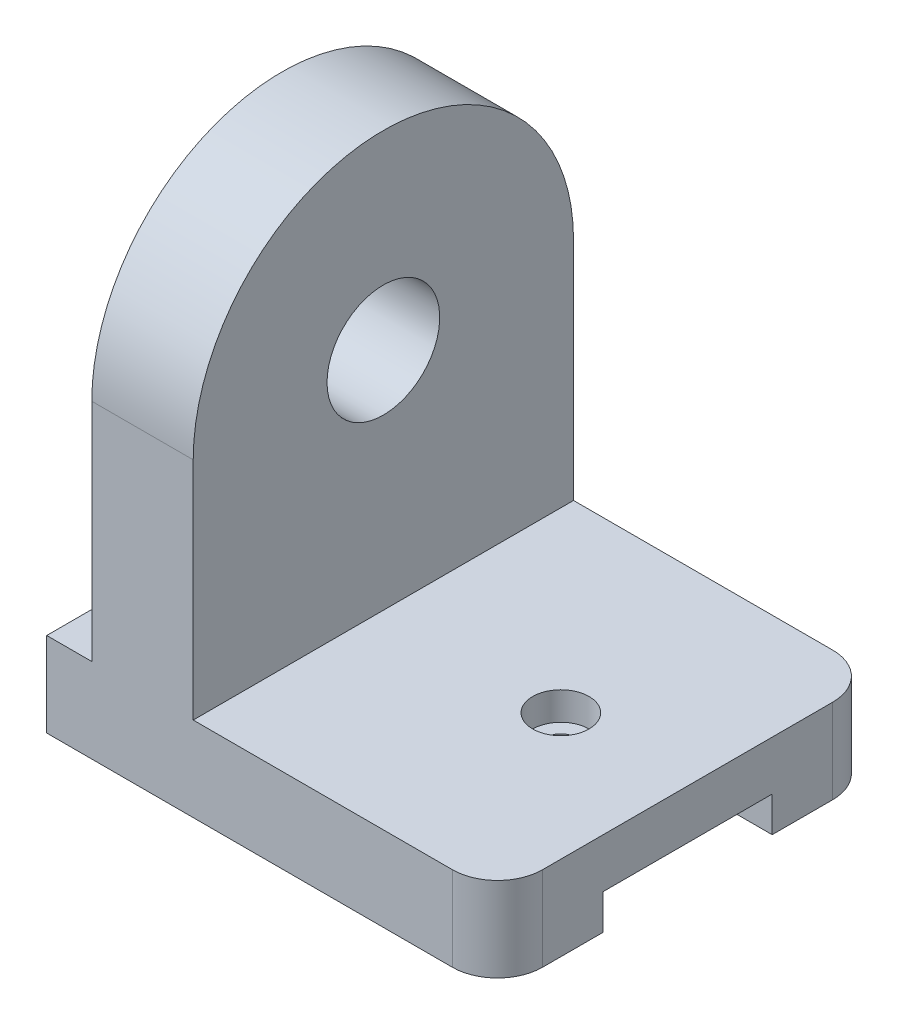
ISO-10303-21;
HEADER;
FILE_DESCRIPTION(('STEP AP214'),'2;1');
FILE_NAME('part.step','',(''),(''),'','','');
FILE_SCHEMA(('AUTOMOTIVE_DESIGN { 1 0 10303 214 1 1 1 1 }'));
ENDSEC;
DATA;
#1=APPLICATION_CONTEXT('core data for automotive mechanical design processes');
#2=APPLICATION_PROTOCOL_DEFINITION('international standard','automotive_design',2000,#1);
#3=PRODUCT_CONTEXT('',#1,'mechanical');
#4=PRODUCT('Part','Part','',(#3));
#5=PRODUCT_RELATED_PRODUCT_CATEGORY('part','',(#4));
#6=PRODUCT_DEFINITION_FORMATION('','',#4);
#7=PRODUCT_DEFINITION_CONTEXT('part definition',#1,'design');
#8=PRODUCT_DEFINITION('design','',#6,#7);
#9=PRODUCT_DEFINITION_SHAPE('','',#8);
#10=(LENGTH_UNIT() NAMED_UNIT(*) SI_UNIT(.MILLI.,.METRE.));
#11=(NAMED_UNIT(*) PLANE_ANGLE_UNIT() SI_UNIT($,.RADIAN.));
#12=(NAMED_UNIT(*) SI_UNIT($,.STERADIAN.) SOLID_ANGLE_UNIT());
#13=UNCERTAINTY_MEASURE_WITH_UNIT(LENGTH_MEASURE(1.E-05),#10,'distance_accuracy_value','');
#14=(GEOMETRIC_REPRESENTATION_CONTEXT(3) GLOBAL_UNCERTAINTY_ASSIGNED_CONTEXT((#13)) GLOBAL_UNIT_ASSIGNED_CONTEXT((#10,
#11,#12)) REPRESENTATION_CONTEXT('',''));
#15=CARTESIAN_POINT('',(0.,0.,0.));
#16=DIRECTION('',(0.,0.,1.));
#17=DIRECTION('',(1.,0.,0.));
#18=AXIS2_PLACEMENT_3D('',#15,#16,#17);
#19=CARTESIAN_POINT('',(32.,0.,0.));
#20=DIRECTION('',(-1.,0.,0.));
#21=DIRECTION('',(0.,0.,1.));
#22=AXIS2_PLACEMENT_3D('',#19,#20,#21);
#23=PLANE('',#22);
#24=CARTESIAN_POINT('',(32.,220.,135.));
#25=DIRECTION('',(-1.,0.,0.));
#26=DIRECTION('',(0.,0.,1.));
#27=AXIS2_PLACEMENT_3D('',#24,#25,#26);
#28=CIRCLE('',#27,40.);
#29=CARTESIAN_POINT('',(32.,220.,175.));
#30=VERTEX_POINT('',#29);
#31=EDGE_CURVE('E45',#30,#30,#28,.T.);
#32=ORIENTED_EDGE('',*,*,#31,.F.);
#33=EDGE_LOOP('',(#32));
#34=FACE_BOUND('',#33,.T.);
#35=CARTESIAN_POINT('',(32.,220.,135.));
#36=DIRECTION('',(-1.,0.,0.));
#37=DIRECTION('',(0.,0.,1.));
#38=AXIS2_PLACEMENT_3D('',#35,#36,#37);
#39=CIRCLE('',#38,80.);
#40=CARTESIAN_POINT('',(32.,220.,215.));
#41=VERTEX_POINT('',#40);
#42=EDGE_CURVE('E195',#41,#41,#39,.T.);
#43=ORIENTED_EDGE('',*,*,#42,.T.);
#44=EDGE_LOOP('',(#43));
#45=FACE_BOUND('',#44,.T.);
#46=ADVANCED_FACE('F41',(#34,#45),#23,.T.);
#47=CARTESIAN_POINT('',(288.,60.,238.));
#48=DIRECTION('',(0.,1.,0.));
#49=DIRECTION('',(0.,0.,1.));
#50=AXIS2_PLACEMENT_3D('',#47,#48,#49);
#51=PLANE('',#50);
#52=DIRECTION('',(1.,0.,0.));
#53=VECTOR('',#52,1.);
#54=CARTESIAN_POINT('',(0.,60.,270.));
#55=LINE('',#54,#53);
#56=CARTESIAN_POINT('',(0.,60.,270.));
#57=VERTEX_POINT('',#56);
#58=CARTESIAN_POINT('',(32.,60.,270.));
#59=VERTEX_POINT('',#58);
#60=EDGE_CURVE('E274',#57,#59,#55,.T.);
#61=ORIENTED_EDGE('',*,*,#60,.T.);
#62=DIRECTION('',(0.,0.,-1.));
#63=VECTOR('',#62,1.);
#64=CARTESIAN_POINT('',(32.,60.,0.));
#65=LINE('',#64,#63);
#66=CARTESIAN_POINT('',(32.,60.,255.));
#67=VERTEX_POINT('',#66);
#68=EDGE_CURVE('E230',#59,#67,#65,.T.);
#69=ORIENTED_EDGE('',*,*,#68,.T.);
#70=DIRECTION('',(-1.,0.,0.));
#71=VECTOR('',#70,1.);
#72=CARTESIAN_POINT('',(52.,60.,255.));
#73=LINE('',#72,#71);
#74=CARTESIAN_POINT('',(52.,60.,255.));
#75=VERTEX_POINT('',#74);
#76=EDGE_CURVE('E203',#75,#67,#73,.T.);
#77=ORIENTED_EDGE('',*,*,#76,.F.);
#78=DIRECTION('',(0.,0.,1.));
#79=VECTOR('',#78,1.);
#80=CARTESIAN_POINT('',(52.,60.,0.));
#81=LINE('',#80,#79);
#82=CARTESIAN_POINT('',(52.,60.,15.));
#83=VERTEX_POINT('',#82);
#84=EDGE_CURVE('E175',#83,#75,#81,.T.);
#85=ORIENTED_EDGE('',*,*,#84,.F.);
#86=DIRECTION('',(-1.,0.,0.));
#87=VECTOR('',#86,1.);
#88=CARTESIAN_POINT('',(52.,60.,15.));
#89=LINE('',#88,#87);
#90=CARTESIAN_POINT('',(32.,60.,15.));
#91=VERTEX_POINT('',#90);
#92=EDGE_CURVE('E205',#83,#91,#89,.T.);
#93=ORIENTED_EDGE('',*,*,#92,.T.);
#94=CARTESIAN_POINT('',(32.,60.,0.));
#95=VERTEX_POINT('',#94);
#96=EDGE_CURVE('E66',#91,#95,#65,.T.);
#97=ORIENTED_EDGE('',*,*,#96,.T.);
#98=DIRECTION('',(-1.,0.,0.));
#99=VECTOR('',#98,1.);
#100=CARTESIAN_POINT('',(0.,60.,0.));
#101=LINE('',#100,#99);
#102=CARTESIAN_POINT('',(0.,60.,0.));
#103=VERTEX_POINT('',#102);
#104=EDGE_CURVE('E282',#95,#103,#101,.T.);
#105=ORIENTED_EDGE('',*,*,#104,.T.);
#106=DIRECTION('',(0.,0.,1.));
#107=VECTOR('',#106,1.);
#108=CARTESIAN_POINT('',(0.,60.,0.));
#109=LINE('',#108,#107);
#110=EDGE_CURVE('E269',#103,#57,#109,.T.);
#111=ORIENTED_EDGE('',*,*,#110,.T.);
#112=EDGE_LOOP('',(#61,#69,#77,#85,#93,#97,#105,#111));
#113=FACE_BOUND('',#112,.T.);
#114=ADVANCED_FACE('F392',(#113),#51,.T.);
#115=CARTESIAN_POINT('',(320.,60.,32.0000000000002));
#116=DIRECTION('',(-1.,0.,0.));
#117=DIRECTION('',(0.,0.,1.));
#118=AXIS2_PLACEMENT_3D('',#115,#116,#117);
#119=PLANE('',#118);
#120=DIRECTION('',(0.,1.,0.));
#121=VECTOR('',#120,1.);
#122=CARTESIAN_POINT('',(320.,-1.2E-05,75.));
#123=LINE('',#122,#121);
#124=CARTESIAN_POINT('',(320.,0.,75.));
#125=VERTEX_POINT('',#124);
#126=CARTESIAN_POINT('',(320.,25.,75.));
#127=VERTEX_POINT('',#126);
#128=EDGE_CURVE('E266',#125,#127,#123,.T.);
#129=ORIENTED_EDGE('',*,*,#128,.F.);
#130=DIRECTION('',(0.,0.,-1.));
#131=VECTOR('',#130,1.);
#132=CARTESIAN_POINT('',(320.,0.,32.0000000000002));
#133=LINE('',#132,#131);
#134=CARTESIAN_POINT('',(320.,0.,32.0000000000002));
#135=VERTEX_POINT('',#134);
#136=EDGE_CURVE('E292',#125,#135,#133,.T.);
#137=ORIENTED_EDGE('',*,*,#136,.T.);
#138=DIRECTION('',(0.,-1.,0.));
#139=VECTOR('',#138,1.);
#140=CARTESIAN_POINT('',(320.,60.,32.0000000000002));
#141=LINE('',#140,#139);
#142=CARTESIAN_POINT('',(320.,60.,32.0000000000002));
#143=VERTEX_POINT('',#142);
#144=EDGE_CURVE('E304',#143,#135,#141,.T.);
#145=ORIENTED_EDGE('',*,*,#144,.F.);
#146=DIRECTION('',(0.,0.,-1.));
#147=VECTOR('',#146,1.);
#148=CARTESIAN_POINT('',(320.,60.,32.0000000000002));
#149=LINE('',#148,#147);
#150=CARTESIAN_POINT('',(320.,60.,238.));
#151=VERTEX_POINT('',#150);
#152=EDGE_CURVE('E278',#151,#143,#149,.T.);
#153=ORIENTED_EDGE('',*,*,#152,.F.);
#154=DIRECTION('',(0.,-1.,0.));
#155=VECTOR('',#154,1.);
#156=CARTESIAN_POINT('',(320.,60.,238.));
#157=LINE('',#156,#155);
#158=CARTESIAN_POINT('',(320.,0.,238.));
#159=VERTEX_POINT('',#158);
#160=EDGE_CURVE('E307',#151,#159,#157,.T.);
#161=ORIENTED_EDGE('',*,*,#160,.T.);
#162=CARTESIAN_POINT('',(320.,0.,195.));
#163=VERTEX_POINT('',#162);
#164=EDGE_CURVE('E293',#159,#163,#133,.T.);
#165=ORIENTED_EDGE('',*,*,#164,.T.);
#166=DIRECTION('',(0.,1.,0.));
#167=VECTOR('',#166,1.);
#168=CARTESIAN_POINT('',(320.,-1.2E-05,195.));
#169=LINE('',#168,#167);
#170=CARTESIAN_POINT('',(320.,25.,195.));
#171=VERTEX_POINT('',#170);
#172=EDGE_CURVE('E262',#163,#171,#169,.T.);
#173=ORIENTED_EDGE('',*,*,#172,.T.);
#174=DIRECTION('',(0.,0.,1.));
#175=VECTOR('',#174,1.);
#176=CARTESIAN_POINT('',(320.,25.,195.));
#177=LINE('',#176,#175);
#178=EDGE_CURVE('E254',#127,#171,#177,.T.);
#179=ORIENTED_EDGE('',*,*,#178,.F.);
#180=EDGE_LOOP('',(#129,#137,#145,#153,#161,#165,#173,#179));
#181=FACE_BOUND('',#180,.T.);
#182=ADVANCED_FACE('F343',(#181),#119,.F.);
#183=CARTESIAN_POINT('',(288.,0.,238.));
#184=DIRECTION('',(0.,1.,0.));
#185=DIRECTION('',(0.,0.,1.));
#186=AXIS2_PLACEMENT_3D('',#183,#184,#185);
#187=PLANE('',#186);
#188=DIRECTION('',(1.,0.,0.));
#189=VECTOR('',#188,1.);
#190=CARTESIAN_POINT('',(288.,0.,75.));
#191=LINE('',#190,#189);
#192=CARTESIAN_POINT('',(230.,0.,75.));
#193=VERTEX_POINT('',#192);
#194=EDGE_CURVE('E11',#193,#125,#191,.T.);
#195=ORIENTED_EDGE('',*,*,#194,.F.);
#196=CARTESIAN_POINT('',(230.,0.,135.));
#197=DIRECTION('',(0.,-1.,0.));
#198=DIRECTION('',(0.,0.,-1.));
#199=AXIS2_PLACEMENT_3D('',#196,#197,#198);
#200=CIRCLE('',#199,60.);
#201=CARTESIAN_POINT('',(230.,0.,195.));
#202=VERTEX_POINT('',#201);
#203=EDGE_CURVE('E316',#193,#202,#200,.F.);
#204=ORIENTED_EDGE('',*,*,#203,.T.);
#205=DIRECTION('',(-1.,0.,0.));
#206=VECTOR('',#205,1.);
#207=CARTESIAN_POINT('',(288.,0.,195.));
#208=LINE('',#207,#206);
#209=EDGE_CURVE('E50',#163,#202,#208,.T.);
#210=ORIENTED_EDGE('',*,*,#209,.F.);
#211=ORIENTED_EDGE('',*,*,#164,.F.);
#212=CARTESIAN_POINT('',(288.,0.,238.));
#213=DIRECTION('',(0.,1.,0.));
#214=DIRECTION('',(0.,0.,1.));
#215=AXIS2_PLACEMENT_3D('',#212,#213,#214);
#216=CIRCLE('',#215,32.);
#217=CARTESIAN_POINT('',(288.,0.,270.));
#218=VERTEX_POINT('',#217);
#219=EDGE_CURVE('E290',#218,#159,#216,.T.);
#220=ORIENTED_EDGE('',*,*,#219,.F.);
#221=DIRECTION('',(1.,0.,0.));
#222=VECTOR('',#221,1.);
#223=CARTESIAN_POINT('',(0.,0.,270.));
#224=LINE('',#223,#222);
#225=CARTESIAN_POINT('',(0.,0.,270.));
#226=VERTEX_POINT('',#225);
#227=EDGE_CURVE('E288',#226,#218,#224,.T.);
#228=ORIENTED_EDGE('',*,*,#227,.F.);
#229=DIRECTION('',(0.,0.,1.));
#230=VECTOR('',#229,1.);
#231=CARTESIAN_POINT('',(0.,0.,0.));
#232=LINE('',#231,#230);
#233=CARTESIAN_POINT('',(0.,0.,0.));
#234=VERTEX_POINT('',#233);
#235=EDGE_CURVE('E268',#234,#226,#232,.T.);
#236=ORIENTED_EDGE('',*,*,#235,.F.);
#237=DIRECTION('',(-1.,0.,0.));
#238=VECTOR('',#237,1.);
#239=CARTESIAN_POINT('',(0.,0.,0.));
#240=LINE('',#239,#238);
#241=CARTESIAN_POINT('',(288.,0.,0.));
#242=VERTEX_POINT('',#241);
#243=EDGE_CURVE('E273',#242,#234,#240,.T.);
#244=ORIENTED_EDGE('',*,*,#243,.F.);
#245=CARTESIAN_POINT('',(288.,0.,32.));
#246=DIRECTION('',(0.,1.,0.));
#247=DIRECTION('',(0.,0.,-1.));
#248=AXIS2_PLACEMENT_3D('',#245,#246,#247);
#249=CIRCLE('',#248,32.);
#250=EDGE_CURVE('E296',#135,#242,#249,.T.);
#251=ORIENTED_EDGE('',*,*,#250,.F.);
#252=ORIENTED_EDGE('',*,*,#136,.F.);
#253=EDGE_LOOP('',(#195,#204,#210,#211,#220,#228,#236,#244,#251,#252));
#254=FACE_BOUND('',#253,.T.);
#255=ADVANCED_FACE('F347',(#254),#187,.F.);
#256=CARTESIAN_POINT('',(0.,60.,0.));
#257=DIRECTION('',(1.,0.,0.));
#258=DIRECTION('',(0.,0.,-1.));
#259=AXIS2_PLACEMENT_3D('',#256,#257,#258);
#260=PLANE('',#259);
#261=ORIENTED_EDGE('',*,*,#235,.T.);
#262=DIRECTION('',(0.,-1.,0.));
#263=VECTOR('',#262,1.);
#264=CARTESIAN_POINT('',(0.,60.,270.));
#265=LINE('',#264,#263);
#266=EDGE_CURVE('E313',#57,#226,#265,.T.);
#267=ORIENTED_EDGE('',*,*,#266,.F.);
#268=ORIENTED_EDGE('',*,*,#110,.F.);
#269=DIRECTION('',(0.,-1.,0.));
#270=VECTOR('',#269,1.);
#271=CARTESIAN_POINT('',(0.,60.,0.));
#272=LINE('',#271,#270);
#273=EDGE_CURVE('E285',#103,#234,#272,.T.);
#274=ORIENTED_EDGE('',*,*,#273,.T.);
#275=EDGE_LOOP('',(#261,#267,#268,#274));
#276=FACE_BOUND('',#275,.T.);
#277=ADVANCED_FACE('F43',(#276),#260,.F.);
#278=CARTESIAN_POINT('',(0.,60.,270.));
#279=DIRECTION('',(0.,0.,-1.));
#280=DIRECTION('',(-1.,0.,0.));
#281=AXIS2_PLACEMENT_3D('',#278,#279,#280);
#282=PLANE('',#281);
#283=ORIENTED_EDGE('',*,*,#227,.T.);
#284=DIRECTION('',(0.,-1.,0.));
#285=VECTOR('',#284,1.);
#286=CARTESIAN_POINT('',(288.,60.,270.));
#287=LINE('',#286,#285);
#288=CARTESIAN_POINT('',(288.,60.,270.));
#289=VERTEX_POINT('',#288);
#290=EDGE_CURVE('E310',#289,#218,#287,.T.);
#291=ORIENTED_EDGE('',*,*,#290,.F.);
#292=CARTESIAN_POINT('',(104.,60.,270.));
#293=VERTEX_POINT('',#292);
#294=EDGE_CURVE('E272',#293,#289,#55,.T.);
#295=ORIENTED_EDGE('',*,*,#294,.F.);
#296=DIRECTION('',(0.,1.,0.));
#297=VECTOR('',#296,1.);
#298=CARTESIAN_POINT('',(104.,0.,270.));
#299=LINE('',#298,#297);
#300=CARTESIAN_POINT('',(104.,220.,270.));
#301=VERTEX_POINT('',#300);
#302=EDGE_CURVE('E221',#293,#301,#299,.T.);
#303=ORIENTED_EDGE('',*,*,#302,.T.);
#304=DIRECTION('',(-1.,0.,0.));
#305=VECTOR('',#304,1.);
#306=CARTESIAN_POINT('',(104.,220.,270.));
#307=LINE('',#306,#305);
#308=CARTESIAN_POINT('',(32.,220.,270.));
#309=VERTEX_POINT('',#308);
#310=EDGE_CURVE('E235',#301,#309,#307,.T.);
#311=ORIENTED_EDGE('',*,*,#310,.T.);
#312=DIRECTION('',(0.,1.,0.));
#313=VECTOR('',#312,1.);
#314=CARTESIAN_POINT('',(32.,0.,270.));
#315=LINE('',#314,#313);
#316=EDGE_CURVE('E216',#59,#309,#315,.T.);
#317=ORIENTED_EDGE('',*,*,#316,.F.);
#318=ORIENTED_EDGE('',*,*,#60,.F.);
#319=ORIENTED_EDGE('',*,*,#266,.T.);
#320=EDGE_LOOP('',(#283,#291,#295,#303,#311,#317,#318,#319));
#321=FACE_BOUND('',#320,.T.);
#322=ADVANCED_FACE('F369',(#321),#282,.F.);
#323=CARTESIAN_POINT('',(288.,60.,238.));
#324=DIRECTION('',(0.,-1.,0.));
#325=DIRECTION('',(0.,0.,-1.));
#326=AXIS2_PLACEMENT_3D('',#323,#324,#325);
#327=CYLINDRICAL_SURFACE('',#326,32.);
#328=ORIENTED_EDGE('',*,*,#219,.T.);
#329=ORIENTED_EDGE('',*,*,#160,.F.);
#330=CARTESIAN_POINT('',(288.,60.,238.));
#331=DIRECTION('',(0.,1.,0.));
#332=DIRECTION('',(0.,0.,1.));
#333=AXIS2_PLACEMENT_3D('',#330,#331,#332);
#334=CIRCLE('',#333,32.);
#335=EDGE_CURVE('E276',#289,#151,#334,.T.);
#336=ORIENTED_EDGE('',*,*,#335,.F.);
#337=ORIENTED_EDGE('',*,*,#290,.T.);
#338=EDGE_LOOP('',(#328,#329,#336,#337));
#339=FACE_BOUND('',#338,.T.);
#340=ADVANCED_FACE('F377',(#339),#327,.T.);
#341=CARTESIAN_POINT('',(288.,60.,32.));
#342=DIRECTION('',(0.,-1.,0.));
#343=DIRECTION('',(0.,0.,-1.));
#344=AXIS2_PLACEMENT_3D('',#341,#342,#343);
#345=CYLINDRICAL_SURFACE('',#344,32.);
#346=ORIENTED_EDGE('',*,*,#250,.T.);
#347=DIRECTION('',(0.,-1.,0.));
#348=VECTOR('',#347,1.);
#349=CARTESIAN_POINT('',(288.,60.,0.));
#350=LINE('',#349,#348);
#351=CARTESIAN_POINT('',(288.,60.,0.));
#352=VERTEX_POINT('',#351);
#353=EDGE_CURVE('E301',#352,#242,#350,.T.);
#354=ORIENTED_EDGE('',*,*,#353,.F.);
#355=CARTESIAN_POINT('',(288.,60.,32.));
#356=DIRECTION('',(0.,1.,0.));
#357=DIRECTION('',(0.,0.,-1.));
#358=AXIS2_PLACEMENT_3D('',#355,#356,#357);
#359=CIRCLE('',#358,32.);
#360=EDGE_CURVE('E280',#143,#352,#359,.T.);
#361=ORIENTED_EDGE('',*,*,#360,.F.);
#362=ORIENTED_EDGE('',*,*,#144,.T.);
#363=EDGE_LOOP('',(#346,#354,#361,#362));
#364=FACE_BOUND('',#363,.T.);
#365=ADVANCED_FACE('F352',(#364),#345,.T.);
#366=CARTESIAN_POINT('',(0.,60.,0.));
#367=DIRECTION('',(0.,0.,1.));
#368=DIRECTION('',(1.,0.,0.));
#369=AXIS2_PLACEMENT_3D('',#366,#367,#368);
#370=PLANE('',#369);
#371=ORIENTED_EDGE('',*,*,#243,.T.);
#372=ORIENTED_EDGE('',*,*,#273,.F.);
#373=ORIENTED_EDGE('',*,*,#104,.F.);
#374=DIRECTION('',(0.,1.,0.));
#375=VECTOR('',#374,1.);
#376=CARTESIAN_POINT('',(32.,0.,0.));
#377=LINE('',#376,#375);
#378=CARTESIAN_POINT('',(32.,220.,0.));
#379=VERTEX_POINT('',#378);
#380=EDGE_CURVE('E227',#95,#379,#377,.T.);
#381=ORIENTED_EDGE('',*,*,#380,.T.);
#382=DIRECTION('',(-1.,0.,0.));
#383=VECTOR('',#382,1.);
#384=CARTESIAN_POINT('',(104.,220.,0.));
#385=LINE('',#384,#383);
#386=CARTESIAN_POINT('',(104.,220.,0.));
#387=VERTEX_POINT('',#386);
#388=EDGE_CURVE('E224',#387,#379,#385,.T.);
#389=ORIENTED_EDGE('',*,*,#388,.F.);
#390=DIRECTION('',(0.,1.,0.));
#391=VECTOR('',#390,1.);
#392=CARTESIAN_POINT('',(104.,0.,0.));
#393=LINE('',#392,#391);
#394=CARTESIAN_POINT('',(104.,60.,0.));
#395=VERTEX_POINT('',#394);
#396=EDGE_CURVE('E215',#395,#387,#393,.T.);
#397=ORIENTED_EDGE('',*,*,#396,.F.);
#398=EDGE_CURVE('E283',#352,#395,#101,.T.);
#399=ORIENTED_EDGE('',*,*,#398,.F.);
#400=ORIENTED_EDGE('',*,*,#353,.T.);
#401=EDGE_LOOP('',(#371,#372,#373,#381,#389,#397,#399,#400));
#402=FACE_BOUND('',#401,.T.);
#403=ADVANCED_FACE('F356',(#402),#370,.F.);
#404=DIRECTION('',(0.,0.,-1.));
#405=VECTOR('',#404,1.);
#406=CARTESIAN_POINT('',(104.,60.,0.));
#407=LINE('',#406,#405);
#408=EDGE_CURVE('E218',#293,#395,#407,.T.);
#409=ORIENTED_EDGE('',*,*,#408,.F.);
#410=ORIENTED_EDGE('',*,*,#294,.T.);
#411=ORIENTED_EDGE('',*,*,#335,.T.);
#412=ORIENTED_EDGE('',*,*,#152,.T.);
#413=ORIENTED_EDGE('',*,*,#360,.T.);
#414=ORIENTED_EDGE('',*,*,#398,.T.);
#415=EDGE_LOOP('',(#409,#410,#411,#412,#413,#414));
#416=FACE_BOUND('',#415,.T.);
#417=CARTESIAN_POINT('',(230.,60.,135.));
#418=DIRECTION('',(0.,1.,0.));
#419=DIRECTION('',(0.,0.,1.));
#420=AXIS2_PLACEMENT_3D('',#417,#418,#419);
#421=CIRCLE('',#420,20.);
#422=CARTESIAN_POINT('',(230.,60.,155.));
#423=VERTEX_POINT('',#422);
#424=EDGE_CURVE('E237',#423,#423,#421,.T.);
#425=ORIENTED_EDGE('',*,*,#424,.F.);
#426=EDGE_LOOP('',(#425));
#427=FACE_BOUND('',#426,.T.);
#428=ADVANCED_FACE('F361',(#416,#427),#51,.T.);
#429=CARTESIAN_POINT('',(320.,-1.2E-05,75.));
#430=DIRECTION('',(0.,0.,1.));
#431=DIRECTION('',(1.,0.,0.));
#432=AXIS2_PLACEMENT_3D('',#429,#430,#431);
#433=PLANE('',#432);
#434=ORIENTED_EDGE('',*,*,#194,.T.);
#435=ORIENTED_EDGE('',*,*,#128,.T.);
#436=DIRECTION('',(1.,0.,0.));
#437=VECTOR('',#436,1.);
#438=CARTESIAN_POINT('',(320.,25.,75.));
#439=LINE('',#438,#437);
#440=CARTESIAN_POINT('',(230.,25.,75.));
#441=VERTEX_POINT('',#440);
#442=EDGE_CURVE('E251',#441,#127,#439,.T.);
#443=ORIENTED_EDGE('',*,*,#442,.F.);
#444=DIRECTION('',(0.,-1.,0.));
#445=VECTOR('',#444,1.);
#446=CARTESIAN_POINT('',(230.,25.,75.));
#447=LINE('',#446,#445);
#448=EDGE_CURVE('E259',#441,#193,#447,.T.);
#449=ORIENTED_EDGE('',*,*,#448,.T.);
#450=EDGE_LOOP('',(#434,#435,#443,#449));
#451=FACE_BOUND('',#450,.T.);
#452=ADVANCED_FACE('F339',(#451),#433,.T.);
#453=CARTESIAN_POINT('',(230.,-1.2E-05,195.));
#454=DIRECTION('',(0.,0.,-1.));
#455=DIRECTION('',(-1.,0.,0.));
#456=AXIS2_PLACEMENT_3D('',#453,#454,#455);
#457=PLANE('',#456);
#458=ORIENTED_EDGE('',*,*,#209,.T.);
#459=DIRECTION('',(0.,-1.,0.));
#460=VECTOR('',#459,1.);
#461=CARTESIAN_POINT('',(230.,25.,195.));
#462=LINE('',#461,#460);
#463=CARTESIAN_POINT('',(230.,25.,195.));
#464=VERTEX_POINT('',#463);
#465=EDGE_CURVE('E260',#464,#202,#462,.T.);
#466=ORIENTED_EDGE('',*,*,#465,.F.);
#467=DIRECTION('',(-1.,0.,0.));
#468=VECTOR('',#467,1.);
#469=CARTESIAN_POINT('',(230.,25.,195.));
#470=LINE('',#469,#468);
#471=EDGE_CURVE('E256',#171,#464,#470,.T.);
#472=ORIENTED_EDGE('',*,*,#471,.F.);
#473=ORIENTED_EDGE('',*,*,#172,.F.);
#474=EDGE_LOOP('',(#458,#466,#472,#473));
#475=FACE_BOUND('',#474,.T.);
#476=ADVANCED_FACE('F382',(#475),#457,.T.);
#477=CARTESIAN_POINT('',(230.,25.,135.));
#478=DIRECTION('',(0.,-1.,0.));
#479=DIRECTION('',(0.,0.,-1.));
#480=AXIS2_PLACEMENT_3D('',#477,#478,#479);
#481=CYLINDRICAL_SURFACE('',#480,60.);
#482=ORIENTED_EDGE('',*,*,#448,.F.);
#483=CARTESIAN_POINT('',(230.,25.,135.));
#484=DIRECTION('',(0.,-1.,0.));
#485=DIRECTION('',(0.,0.,-1.));
#486=AXIS2_PLACEMENT_3D('',#483,#484,#485);
#487=CIRCLE('',#486,60.);
#488=EDGE_CURVE('E248',#464,#441,#487,.T.);
#489=ORIENTED_EDGE('',*,*,#488,.F.);
#490=ORIENTED_EDGE('',*,*,#465,.T.);
#491=ORIENTED_EDGE('',*,*,#203,.F.);
#492=EDGE_LOOP('',(#482,#489,#490,#491));
#493=FACE_BOUND('',#492,.T.);
#494=ADVANCED_FACE('F329',(#493),#481,.F.);
#495=CARTESIAN_POINT('',(230.,25.,135.));
#496=DIRECTION('',(0.,-1.,0.));
#497=DIRECTION('',(0.,0.,-1.));
#498=AXIS2_PLACEMENT_3D('',#495,#496,#497);
#499=PLANE('',#498);
#500=CARTESIAN_POINT('',(230.,25.,135.));
#501=DIRECTION('',(0.,-1.,0.));
#502=DIRECTION('',(0.,0.,-1.));
#503=AXIS2_PLACEMENT_3D('',#500,#501,#502);
#504=CIRCLE('',#503,9.99999999999999);
#505=CARTESIAN_POINT('',(230.,25.,125.));
#506=VERTEX_POINT('',#505);
#507=EDGE_CURVE('E247',#506,#506,#504,.T.);
#508=ORIENTED_EDGE('',*,*,#507,.F.);
#509=EDGE_LOOP('',(#508));
#510=FACE_BOUND('',#509,.T.);
#511=ORIENTED_EDGE('',*,*,#488,.T.);
#512=ORIENTED_EDGE('',*,*,#442,.T.);
#513=ORIENTED_EDGE('',*,*,#178,.T.);
#514=ORIENTED_EDGE('',*,*,#471,.T.);
#515=EDGE_LOOP('',(#511,#512,#513,#514));
#516=FACE_BOUND('',#515,.T.);
#517=ADVANCED_FACE('F326',(#510,#516),#499,.T.);
#518=CARTESIAN_POINT('',(230.,60.,135.));
#519=DIRECTION('',(0.,1.,0.));
#520=DIRECTION('',(0.,0.,1.));
#521=AXIS2_PLACEMENT_3D('',#518,#519,#520);
#522=CYLINDRICAL_SURFACE('',#521,9.99999999999999);
#523=ORIENTED_EDGE('',*,*,#507,.T.);
#524=EDGE_LOOP('',(#523));
#525=FACE_BOUND('',#524,.T.);
#526=CARTESIAN_POINT('',(230.,40.,135.));
#527=DIRECTION('',(0.,1.,0.));
#528=DIRECTION('',(0.,0.,1.));
#529=AXIS2_PLACEMENT_3D('',#526,#527,#528);
#530=CIRCLE('',#529,9.99999999999998);
#531=CARTESIAN_POINT('',(230.,40.,145.));
#532=VERTEX_POINT('',#531);
#533=EDGE_CURVE('E244',#532,#532,#530,.T.);
#534=ORIENTED_EDGE('',*,*,#533,.T.);
#535=EDGE_LOOP('',(#534));
#536=FACE_BOUND('',#535,.T.);
#537=ADVANCED_FACE('F323',(#525,#536),#522,.F.);
#538=CARTESIAN_POINT('',(240.,40.,135.));
#539=DIRECTION('',(0.,-1.,0.));
#540=DIRECTION('',(0.,0.,-1.));
#541=AXIS2_PLACEMENT_3D('',#538,#539,#540);
#542=PLANE('',#541);
#543=ORIENTED_EDGE('',*,*,#533,.F.);
#544=EDGE_LOOP('',(#543));
#545=FACE_BOUND('',#544,.T.);
#546=CARTESIAN_POINT('',(230.,40.,135.));
#547=DIRECTION('',(0.,1.,0.));
#548=DIRECTION('',(0.,0.,1.));
#549=AXIS2_PLACEMENT_3D('',#546,#547,#548);
#550=CIRCLE('',#549,20.);
#551=CARTESIAN_POINT('',(230.,40.,155.));
#552=VERTEX_POINT('',#551);
#553=EDGE_CURVE('E241',#552,#552,#550,.T.);
#554=ORIENTED_EDGE('',*,*,#553,.T.);
#555=EDGE_LOOP('',(#554));
#556=FACE_BOUND('',#555,.T.);
#557=ADVANCED_FACE('F484',(#545,#556),#542,.F.);
#558=CARTESIAN_POINT('',(230.,60.,135.));
#559=DIRECTION('',(0.,1.,0.));
#560=DIRECTION('',(0.,0.,1.));
#561=AXIS2_PLACEMENT_3D('',#558,#559,#560);
#562=CYLINDRICAL_SURFACE('',#561,20.);
#563=ORIENTED_EDGE('',*,*,#553,.F.);
#564=EDGE_LOOP('',(#563));
#565=FACE_BOUND('',#564,.T.);
#566=ORIENTED_EDGE('',*,*,#424,.T.);
#567=EDGE_LOOP('',(#566));
#568=FACE_BOUND('',#567,.T.);
#569=ADVANCED_FACE('F492',(#565,#568),#562,.F.);
#570=CARTESIAN_POINT('',(104.,220.,135.));
#571=DIRECTION('',(-1.,0.,0.));
#572=DIRECTION('',(0.,0.,1.));
#573=AXIS2_PLACEMENT_3D('',#570,#571,#572);
#574=CYLINDRICAL_SURFACE('',#573,135.);
#575=CARTESIAN_POINT('',(32.,220.,135.));
#576=DIRECTION('',(-1.,0.,0.));
#577=DIRECTION('',(0.,0.,1.));
#578=AXIS2_PLACEMENT_3D('',#575,#576,#577);
#579=CIRCLE('',#578,135.);
#580=EDGE_CURVE('E211',#309,#379,#579,.T.);
#581=ORIENTED_EDGE('',*,*,#580,.F.);
#582=ORIENTED_EDGE('',*,*,#310,.F.);
#583=CARTESIAN_POINT('',(104.,220.,135.));
#584=DIRECTION('',(-1.,0.,0.));
#585=DIRECTION('',(0.,0.,1.));
#586=AXIS2_PLACEMENT_3D('',#583,#584,#585);
#587=CIRCLE('',#586,135.);
#588=EDGE_CURVE('E212',#301,#387,#587,.T.);
#589=ORIENTED_EDGE('',*,*,#588,.T.);
#590=ORIENTED_EDGE('',*,*,#388,.T.);
#591=EDGE_LOOP('',(#581,#582,#589,#590));
#592=FACE_BOUND('',#591,.T.);
#593=ADVANCED_FACE('F414',(#592),#574,.T.);
#594=CARTESIAN_POINT('',(104.,0.,0.));
#595=DIRECTION('',(-1.,0.,0.));
#596=DIRECTION('',(0.,0.,1.));
#597=AXIS2_PLACEMENT_3D('',#594,#595,#596);
#598=PLANE('',#597);
#599=CARTESIAN_POINT('',(104.,220.,135.));
#600=DIRECTION('',(-1.,0.,0.));
#601=DIRECTION('',(0.,0.,1.));
#602=AXIS2_PLACEMENT_3D('',#599,#600,#601);
#603=CIRCLE('',#602,40.);
#604=CARTESIAN_POINT('',(104.,220.,175.));
#605=VERTEX_POINT('',#604);
#606=EDGE_CURVE('E208',#605,#605,#603,.T.);
#607=ORIENTED_EDGE('',*,*,#606,.T.);
#608=EDGE_LOOP('',(#607));
#609=FACE_BOUND('',#608,.T.);
#610=ORIENTED_EDGE('',*,*,#588,.F.);
#611=ORIENTED_EDGE('',*,*,#302,.F.);
#612=ORIENTED_EDGE('',*,*,#408,.T.);
#613=ORIENTED_EDGE('',*,*,#396,.T.);
#614=EDGE_LOOP('',(#610,#611,#612,#613));
#615=FACE_BOUND('',#614,.T.);
#616=ADVANCED_FACE('F367',(#609,#615),#598,.F.);
#617=DIRECTION('',(0.,1.,0.));
#618=VECTOR('',#617,1.);
#619=CARTESIAN_POINT('',(32.,0.,255.));
#620=LINE('',#619,#618);
#621=CARTESIAN_POINT('',(32.,220.,255.));
#622=VERTEX_POINT('',#621);
#623=EDGE_CURVE('E58',#67,#622,#620,.T.);
#624=ORIENTED_EDGE('',*,*,#623,.F.);
#625=ORIENTED_EDGE('',*,*,#68,.F.);
#626=ORIENTED_EDGE('',*,*,#316,.T.);
#627=ORIENTED_EDGE('',*,*,#580,.T.);
#628=ORIENTED_EDGE('',*,*,#380,.F.);
#629=ORIENTED_EDGE('',*,*,#96,.F.);
#630=DIRECTION('',(0.,-1.,0.));
#631=VECTOR('',#630,1.);
#632=CARTESIAN_POINT('',(32.,0.,15.));
#633=LINE('',#632,#631);
#634=CARTESIAN_POINT('',(32.,220.,15.));
#635=VERTEX_POINT('',#634);
#636=EDGE_CURVE('E190',#635,#91,#633,.T.);
#637=ORIENTED_EDGE('',*,*,#636,.F.);
#638=CARTESIAN_POINT('',(32.,220.,135.));
#639=DIRECTION('',(-1.,0.,0.));
#640=DIRECTION('',(0.,0.,1.));
#641=AXIS2_PLACEMENT_3D('',#638,#639,#640);
#642=CIRCLE('',#641,120.);
#643=EDGE_CURVE('E199',#622,#635,#642,.T.);
#644=ORIENTED_EDGE('',*,*,#643,.F.);
#645=EDGE_LOOP('',(#624,#625,#626,#627,#628,#629,#637,#644));
#646=FACE_BOUND('',#645,.T.);
#647=ADVANCED_FACE('F395',(#646),#23,.T.);
#648=CARTESIAN_POINT('',(320.,220.,135.));
#649=DIRECTION('',(-1.,0.,0.));
#650=DIRECTION('',(0.,0.,1.));
#651=AXIS2_PLACEMENT_3D('',#648,#649,#650);
#652=CYLINDRICAL_SURFACE('',#651,40.);
#653=ORIENTED_EDGE('',*,*,#31,.T.);
#654=EDGE_LOOP('',(#653));
#655=FACE_BOUND('',#654,.T.);
#656=ORIENTED_EDGE('',*,*,#606,.F.);
#657=EDGE_LOOP('',(#656));
#658=FACE_BOUND('',#657,.T.);
#659=ADVANCED_FACE('F406',(#655,#658),#652,.F.);
#660=CARTESIAN_POINT('',(52.,0.,255.));
#661=DIRECTION('',(0.,0.,1.));
#662=DIRECTION('',(1.,0.,0.));
#663=AXIS2_PLACEMENT_3D('',#660,#661,#662);
#664=PLANE('',#663);
#665=ORIENTED_EDGE('',*,*,#623,.T.);
#666=DIRECTION('',(-1.,0.,0.));
#667=VECTOR('',#666,1.);
#668=CARTESIAN_POINT('',(52.,220.,255.));
#669=LINE('',#668,#667);
#670=CARTESIAN_POINT('',(52.,220.,255.));
#671=VERTEX_POINT('',#670);
#672=EDGE_CURVE('E165',#671,#622,#669,.T.);
#673=ORIENTED_EDGE('',*,*,#672,.F.);
#674=DIRECTION('',(0.,1.,0.));
#675=VECTOR('',#674,1.);
#676=CARTESIAN_POINT('',(52.,0.,255.));
#677=LINE('',#676,#675);
#678=EDGE_CURVE('E169',#75,#671,#677,.T.);
#679=ORIENTED_EDGE('',*,*,#678,.F.);
#680=ORIENTED_EDGE('',*,*,#76,.T.);
#681=EDGE_LOOP('',(#665,#673,#679,#680));
#682=FACE_BOUND('',#681,.T.);
#683=ADVANCED_FACE('F167',(#682),#664,.F.);
#684=CARTESIAN_POINT('',(52.,0.,15.));
#685=DIRECTION('',(0.,0.,-1.));
#686=DIRECTION('',(-1.,0.,0.));
#687=AXIS2_PLACEMENT_3D('',#684,#685,#686);
#688=PLANE('',#687);
#689=ORIENTED_EDGE('',*,*,#636,.T.);
#690=ORIENTED_EDGE('',*,*,#92,.F.);
#691=DIRECTION('',(0.,-1.,0.));
#692=VECTOR('',#691,1.);
#693=CARTESIAN_POINT('',(52.,0.,15.));
#694=LINE('',#693,#692);
#695=CARTESIAN_POINT('',(52.,220.,15.));
#696=VERTEX_POINT('',#695);
#697=EDGE_CURVE('E183',#696,#83,#694,.T.);
#698=ORIENTED_EDGE('',*,*,#697,.F.);
#699=DIRECTION('',(-1.,0.,0.));
#700=VECTOR('',#699,1.);
#701=CARTESIAN_POINT('',(52.,220.,15.));
#702=LINE('',#701,#700);
#703=EDGE_CURVE('E174',#696,#635,#702,.T.);
#704=ORIENTED_EDGE('',*,*,#703,.T.);
#705=EDGE_LOOP('',(#689,#690,#698,#704));
#706=FACE_BOUND('',#705,.T.);
#707=ADVANCED_FACE('F546',(#706),#688,.F.);
#708=CARTESIAN_POINT('',(52.,220.,135.));
#709=DIRECTION('',(-1.,0.,0.));
#710=DIRECTION('',(0.,0.,1.));
#711=AXIS2_PLACEMENT_3D('',#708,#709,#710);
#712=CYLINDRICAL_SURFACE('',#711,80.);
#713=CARTESIAN_POINT('',(52.,220.,135.));
#714=DIRECTION('',(-1.,0.,0.));
#715=DIRECTION('',(0.,0.,1.));
#716=AXIS2_PLACEMENT_3D('',#713,#714,#715);
#717=CIRCLE('',#716,80.);
#718=CARTESIAN_POINT('',(52.,220.,215.));
#719=VERTEX_POINT('',#718);
#720=EDGE_CURVE('E187',#719,#719,#717,.T.);
#721=ORIENTED_EDGE('',*,*,#720,.T.);
#722=EDGE_LOOP('',(#721));
#723=FACE_BOUND('',#722,.T.);
#724=ORIENTED_EDGE('',*,*,#42,.F.);
#725=EDGE_LOOP('',(#724));
#726=FACE_BOUND('',#725,.T.);
#727=ADVANCED_FACE('F556',(#723,#726),#712,.T.);
#728=CARTESIAN_POINT('',(52.,220.,135.));
#729=DIRECTION('',(-1.,0.,0.));
#730=DIRECTION('',(0.,0.,1.));
#731=AXIS2_PLACEMENT_3D('',#728,#729,#730);
#732=CYLINDRICAL_SURFACE('',#731,120.);
#733=ORIENTED_EDGE('',*,*,#643,.T.);
#734=ORIENTED_EDGE('',*,*,#703,.F.);
#735=CARTESIAN_POINT('',(52.,220.,135.));
#736=DIRECTION('',(-1.,0.,0.));
#737=DIRECTION('',(0.,0.,1.));
#738=AXIS2_PLACEMENT_3D('',#735,#736,#737);
#739=CIRCLE('',#738,120.);
#740=EDGE_CURVE('E178',#671,#696,#739,.T.);
#741=ORIENTED_EDGE('',*,*,#740,.F.);
#742=ORIENTED_EDGE('',*,*,#672,.T.);
#743=EDGE_LOOP('',(#733,#734,#741,#742));
#744=FACE_BOUND('',#743,.T.);
#745=ADVANCED_FACE('F179',(#744),#732,.F.);
#746=CARTESIAN_POINT('',(52.,0.,0.));
#747=DIRECTION('',(-1.,0.,0.));
#748=DIRECTION('',(0.,0.,1.));
#749=AXIS2_PLACEMENT_3D('',#746,#747,#748);
#750=PLANE('',#749);
#751=ORIENTED_EDGE('',*,*,#720,.F.);
#752=EDGE_LOOP('',(#751));
#753=FACE_BOUND('',#752,.T.);
#754=ORIENTED_EDGE('',*,*,#678,.T.);
#755=ORIENTED_EDGE('',*,*,#740,.T.);
#756=ORIENTED_EDGE('',*,*,#697,.T.);
#757=ORIENTED_EDGE('',*,*,#84,.T.);
#758=EDGE_LOOP('',(#754,#755,#756,#757));
#759=FACE_BOUND('',#758,.T.);
#760=ADVANCED_FACE('F185',(#753,#759),#750,.T.);
#761=CLOSED_SHELL('',(#46,#114,#182,#255,#277,#322,#340,#365,#403,#428,#452,#476,#494,#517,#537,
#557,#569,#593,#616,#647,#659,#683,#707,#727,#745,#760));
#762=MANIFOLD_SOLID_BREP('B2',#761);
#763=ADVANCED_BREP_SHAPE_REPRESENTATION('',(#18,#762),#14);
#764=SHAPE_DEFINITION_REPRESENTATION(#9,#763);
ENDSEC;
END-ISO-10303-21;
